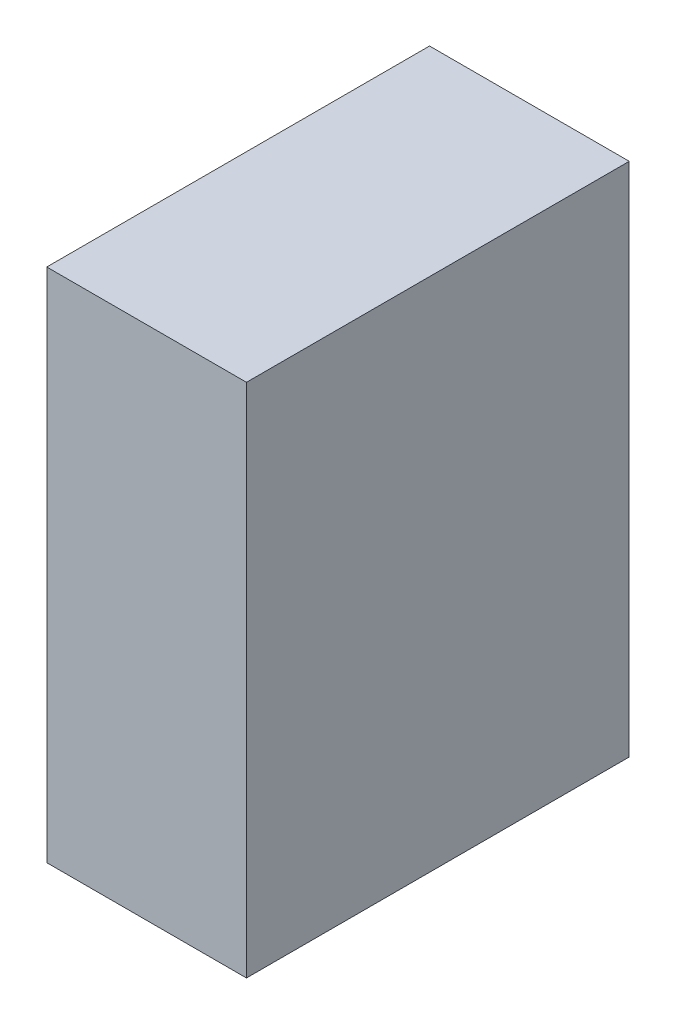
ISO-10303-21;
HEADER;
FILE_DESCRIPTION(('STEP AP214'),'2;1');
FILE_NAME('part.step','',(''),(''),'','','');
FILE_SCHEMA(('AUTOMOTIVE_DESIGN { 1 0 10303 214 1 1 1 1 }'));
ENDSEC;
DATA;
#1=APPLICATION_CONTEXT('core data for automotive mechanical design processes');
#2=APPLICATION_PROTOCOL_DEFINITION('international standard','automotive_design',2000,#1);
#3=PRODUCT_CONTEXT('',#1,'mechanical');
#4=PRODUCT('Part','Part','',(#3));
#5=PRODUCT_RELATED_PRODUCT_CATEGORY('part','',(#4));
#6=PRODUCT_DEFINITION_FORMATION('','',#4);
#7=PRODUCT_DEFINITION_CONTEXT('part definition',#1,'design');
#8=PRODUCT_DEFINITION('design','',#6,#7);
#9=PRODUCT_DEFINITION_SHAPE('','',#8);
#10=(LENGTH_UNIT() NAMED_UNIT(*) SI_UNIT(.MILLI.,.METRE.));
#11=(NAMED_UNIT(*) PLANE_ANGLE_UNIT() SI_UNIT($,.RADIAN.));
#12=(NAMED_UNIT(*) SI_UNIT($,.STERADIAN.) SOLID_ANGLE_UNIT());
#13=UNCERTAINTY_MEASURE_WITH_UNIT(LENGTH_MEASURE(1.E-05),#10,'distance_accuracy_value','');
#14=(GEOMETRIC_REPRESENTATION_CONTEXT(3) GLOBAL_UNCERTAINTY_ASSIGNED_CONTEXT((#13)) GLOBAL_UNIT_ASSIGNED_CONTEXT((#10,
#11,#12)) REPRESENTATION_CONTEXT('',''));
#15=CARTESIAN_POINT('',(0.,0.,0.));
#16=DIRECTION('',(0.,0.,1.));
#17=DIRECTION('',(1.,0.,0.));
#18=AXIS2_PLACEMENT_3D('',#15,#16,#17);
#19=CARTESIAN_POINT('',(76.2,72.9306930693069,41.0235148514852));
#20=DIRECTION('',(0.,0.,-1.));
#21=DIRECTION('',(0.,1.,0.));
#22=AXIS2_PLACEMENT_3D('',#19,#20,#21);
#23=PLANE('',#22);
#24=DIRECTION('',(0.,-1.,0.));
#25=VECTOR('',#24,1.);
#26=CARTESIAN_POINT('',(0.,72.9306930693069,41.0235148514852));
#27=LINE('',#26,#25);
#28=CARTESIAN_POINT('',(0.,72.9306930693069,41.0235148514852));
#29=VERTEX_POINT('',#28);
#30=CARTESIAN_POINT('',(0.,-123.919306930693,41.0235148514851));
#31=VERTEX_POINT('',#30);
#32=EDGE_CURVE('E119',#29,#31,#27,.T.);
#33=ORIENTED_EDGE('',*,*,#32,.T.);
#34=DIRECTION('',(-1.,0.,0.));
#35=VECTOR('',#34,1.);
#36=CARTESIAN_POINT('',(76.2,-123.919306930693,41.0235148514851));
#37=LINE('',#36,#35);
#38=CARTESIAN_POINT('',(76.2,-123.919306930693,41.0235148514851));
#39=VERTEX_POINT('',#38);
#40=EDGE_CURVE('E11',#39,#31,#37,.T.);
#41=ORIENTED_EDGE('',*,*,#40,.F.);
#42=DIRECTION('',(0.,-1.,0.));
#43=VECTOR('',#42,1.);
#44=CARTESIAN_POINT('',(76.2,72.9306930693069,41.0235148514852));
#45=LINE('',#44,#43);
#46=CARTESIAN_POINT('',(76.2,72.9306930693069,41.0235148514852));
#47=VERTEX_POINT('',#46);
#48=EDGE_CURVE('E101',#47,#39,#45,.T.);
#49=ORIENTED_EDGE('',*,*,#48,.F.);
#50=DIRECTION('',(-1.,0.,0.));
#51=VECTOR('',#50,1.);
#52=CARTESIAN_POINT('',(76.2,72.9306930693069,41.0235148514852));
#53=LINE('',#52,#51);
#54=EDGE_CURVE('E115',#47,#29,#53,.T.);
#55=ORIENTED_EDGE('',*,*,#54,.T.);
#56=EDGE_LOOP('',(#33,#41,#49,#55));
#57=FACE_BOUND('',#56,.T.);
#58=ADVANCED_FACE('F47',(#57),#23,.F.);
#59=CARTESIAN_POINT('',(76.2,-123.919306930693,41.0235148514851));
#60=DIRECTION('',(0.,1.,0.));
#61=DIRECTION('',(0.,0.,1.));
#62=AXIS2_PLACEMENT_3D('',#59,#60,#61);
#63=PLANE('',#62);
#64=CARTESIAN_POINT('',(30.4600000000002,-123.919306930693,-30.4464851485151));
#65=DIRECTION('',(0.,-1.,0.));
#66=DIRECTION('',(0.,0.,-1.));
#67=AXIS2_PLACEMENT_3D('',#64,#65,#66);
#68=CIRCLE('',#67,3.96875000000008);
#69=CARTESIAN_POINT('',(30.4600000000002,-123.919306930693,-34.4152351485152));
#70=VERTEX_POINT('',#69);
#71=EDGE_CURVE('E182',#70,#70,#68,.T.);
#72=ORIENTED_EDGE('',*,*,#71,.F.);
#73=EDGE_LOOP('',(#72));
#74=FACE_BOUND('',#73,.T.);
#75=CARTESIAN_POINT('',(24.8406265766137,-123.919306930693,29.145383001778));
#76=DIRECTION('',(0.,-1.,0.));
#77=DIRECTION('',(0.,0.,-1.));
#78=AXIS2_PLACEMENT_3D('',#75,#76,#77);
#79=CIRCLE('',#78,3.96875000000008);
#80=CARTESIAN_POINT('',(24.8406265766137,-123.919306930693,25.176633001778));
#81=VERTEX_POINT('',#80);
#82=EDGE_CURVE('E172',#81,#81,#79,.T.);
#83=ORIENTED_EDGE('',*,*,#82,.F.);
#84=EDGE_LOOP('',(#83));
#85=FACE_BOUND('',#84,.T.);
#86=CARTESIAN_POINT('',(15.9600000000002,-123.919306930693,29.5535148514849));
#87=DIRECTION('',(0.,-1.,0.));
#88=DIRECTION('',(0.,0.,-1.));
#89=AXIS2_PLACEMENT_3D('',#86,#87,#88);
#90=CIRCLE('',#89,3.96875000000008);
#91=CARTESIAN_POINT('',(15.9600000000002,-123.919306930693,25.5847648514849));
#92=VERTEX_POINT('',#91);
#93=EDGE_CURVE('E167',#92,#92,#90,.T.);
#94=ORIENTED_EDGE('',*,*,#93,.F.);
#95=EDGE_LOOP('',(#94));
#96=FACE_BOUND('',#95,.T.);
#97=DIRECTION('',(0.,0.,-1.));
#98=VECTOR('',#97,1.);
#99=CARTESIAN_POINT('',(0.,-123.919306930693,41.0235148514851));
#100=LINE('',#99,#98);
#101=CARTESIAN_POINT('',(0.,-123.919306930693,-105.026485148515));
#102=VERTEX_POINT('',#101);
#103=EDGE_CURVE('E106',#31,#102,#100,.T.);
#104=ORIENTED_EDGE('',*,*,#103,.T.);
#105=DIRECTION('',(-1.,0.,0.));
#106=VECTOR('',#105,1.);
#107=CARTESIAN_POINT('',(76.2,-123.919306930693,-105.026485148515));
#108=LINE('',#107,#106);
#109=CARTESIAN_POINT('',(76.2,-123.919306930693,-105.026485148515));
#110=VERTEX_POINT('',#109);
#111=EDGE_CURVE('E57',#110,#102,#108,.T.);
#112=ORIENTED_EDGE('',*,*,#111,.F.);
#113=DIRECTION('',(0.,0.,-1.));
#114=VECTOR('',#113,1.);
#115=CARTESIAN_POINT('',(76.2,-123.919306930693,41.0235148514851));
#116=LINE('',#115,#114);
#117=EDGE_CURVE('E96',#39,#110,#116,.T.);
#118=ORIENTED_EDGE('',*,*,#117,.F.);
#119=ORIENTED_EDGE('',*,*,#40,.T.);
#120=EDGE_LOOP('',(#104,#112,#118,#119));
#121=FACE_BOUND('',#120,.T.);
#122=ADVANCED_FACE('F105',(#74,#85,#96,#121),#63,.F.);
#123=CARTESIAN_POINT('',(76.2,72.9306930693069,-105.026485148515));
#124=DIRECTION('',(0.,0.,1.));
#125=DIRECTION('',(0.,-1.,0.));
#126=AXIS2_PLACEMENT_3D('',#123,#124,#125);
#127=PLANE('',#126);
#128=CARTESIAN_POINT('',(20.9600000000001,-56.151306930693,-105.026485148515));
#129=DIRECTION('',(0.,0.,-1.));
#130=DIRECTION('',(0.,1.,0.));
#131=AXIS2_PLACEMENT_3D('',#128,#129,#130);
#132=CIRCLE('',#131,4.);
#133=CARTESIAN_POINT('',(20.9600000000001,-52.151306930693,-105.026485148515));
#134=VERTEX_POINT('',#133);
#135=EDGE_CURVE('E199',#134,#134,#132,.T.);
#136=ORIENTED_EDGE('',*,*,#135,.F.);
#137=EDGE_LOOP('',(#136));
#138=FACE_BOUND('',#137,.T.);
#139=CARTESIAN_POINT('',(20.9600000000001,13.8486930693069,-105.026485148515));
#140=DIRECTION('',(0.,0.,-1.));
#141=DIRECTION('',(0.,1.,0.));
#142=AXIS2_PLACEMENT_3D('',#139,#140,#141);
#143=CIRCLE('',#142,4.);
#144=CARTESIAN_POINT('',(20.9600000000001,17.8486930693069,-105.026485148515));
#145=VERTEX_POINT('',#144);
#146=EDGE_CURVE('E195',#145,#145,#143,.T.);
#147=ORIENTED_EDGE('',*,*,#146,.F.);
#148=EDGE_LOOP('',(#147));
#149=FACE_BOUND('',#148,.T.);
#150=DIRECTION('',(0.,1.,0.));
#151=VECTOR('',#150,1.);
#152=CARTESIAN_POINT('',(0.,72.9306930693069,-105.026485148515));
#153=LINE('',#152,#151);
#154=CARTESIAN_POINT('',(0.,72.9306930693069,-105.026485148515));
#155=VERTEX_POINT('',#154);
#156=EDGE_CURVE('E83',#102,#155,#153,.T.);
#157=ORIENTED_EDGE('',*,*,#156,.T.);
#158=DIRECTION('',(-1.,0.,0.));
#159=VECTOR('',#158,1.);
#160=CARTESIAN_POINT('',(76.2,72.9306930693069,-105.026485148515));
#161=LINE('',#160,#159);
#162=CARTESIAN_POINT('',(76.2,72.9306930693069,-105.026485148515));
#163=VERTEX_POINT('',#162);
#164=EDGE_CURVE('E108',#163,#155,#161,.T.);
#165=ORIENTED_EDGE('',*,*,#164,.F.);
#166=DIRECTION('',(0.,1.,0.));
#167=VECTOR('',#166,1.);
#168=CARTESIAN_POINT('',(76.2,72.9306930693069,-105.026485148515));
#169=LINE('',#168,#167);
#170=EDGE_CURVE('E99',#110,#163,#169,.T.);
#171=ORIENTED_EDGE('',*,*,#170,.F.);
#172=ORIENTED_EDGE('',*,*,#111,.T.);
#173=EDGE_LOOP('',(#157,#165,#171,#172));
#174=FACE_BOUND('',#173,.T.);
#175=ADVANCED_FACE('F110',(#138,#149,#174),#127,.F.);
#176=CARTESIAN_POINT('',(76.2,72.9306930693069,41.0235148514852));
#177=DIRECTION('',(0.,-1.,0.));
#178=DIRECTION('',(0.,0.,-1.));
#179=AXIS2_PLACEMENT_3D('',#176,#177,#178);
#180=PLANE('',#179);
#181=DIRECTION('',(0.,0.,1.));
#182=VECTOR('',#181,1.);
#183=CARTESIAN_POINT('',(0.,72.9306930693069,41.0235148514852));
#184=LINE('',#183,#182);
#185=EDGE_CURVE('E89',#155,#29,#184,.T.);
#186=ORIENTED_EDGE('',*,*,#185,.T.);
#187=ORIENTED_EDGE('',*,*,#54,.F.);
#188=DIRECTION('',(0.,0.,1.));
#189=VECTOR('',#188,1.);
#190=CARTESIAN_POINT('',(76.2,72.9306930693069,41.0235148514852));
#191=LINE('',#190,#189);
#192=EDGE_CURVE('E66',#163,#47,#191,.T.);
#193=ORIENTED_EDGE('',*,*,#192,.F.);
#194=ORIENTED_EDGE('',*,*,#164,.T.);
#195=EDGE_LOOP('',(#186,#187,#193,#194));
#196=FACE_BOUND('',#195,.T.);
#197=ADVANCED_FACE('F219',(#196),#180,.F.);
#198=CARTESIAN_POINT('',(76.2,0.,0.));
#199=DIRECTION('',(1.,0.,0.));
#200=DIRECTION('',(0.,0.,-1.));
#201=AXIS2_PLACEMENT_3D('',#198,#199,#200);
#202=PLANE('',#201);
#203=ORIENTED_EDGE('',*,*,#48,.T.);
#204=ORIENTED_EDGE('',*,*,#117,.T.);
#205=ORIENTED_EDGE('',*,*,#170,.T.);
#206=ORIENTED_EDGE('',*,*,#192,.T.);
#207=EDGE_LOOP('',(#203,#204,#205,#206));
#208=FACE_BOUND('',#207,.T.);
#209=ADVANCED_FACE('F97',(#208),#202,.T.);
#210=CARTESIAN_POINT('',(0.,0.,0.));
#211=DIRECTION('',(1.,0.,0.));
#212=DIRECTION('',(0.,0.,-1.));
#213=AXIS2_PLACEMENT_3D('',#210,#211,#212);
#214=PLANE('',#213);
#215=ORIENTED_EDGE('',*,*,#32,.F.);
#216=ORIENTED_EDGE('',*,*,#185,.F.);
#217=ORIENTED_EDGE('',*,*,#156,.F.);
#218=ORIENTED_EDGE('',*,*,#103,.F.);
#219=EDGE_LOOP('',(#215,#216,#217,#218));
#220=FACE_BOUND('',#219,.T.);
#221=ADVANCED_FACE('F247',(#220),#214,.F.);
#222=CARTESIAN_POINT('',(15.9600000000002,-73.3513105306931,29.5535148514849));
#223=DIRECTION('',(0.,-1.,0.));
#224=DIRECTION('',(0.,0.,-1.));
#225=AXIS2_PLACEMENT_3D('',#222,#223,#224);
#226=PLANE('',#225);
#227=CARTESIAN_POINT('',(15.9600000000002,-73.3513105306931,29.5535148514849));
#228=DIRECTION('',(0.,-1.,0.));
#229=DIRECTION('',(0.,0.,-1.));
#230=AXIS2_PLACEMENT_3D('',#227,#228,#229);
#231=CIRCLE('',#230,3.96875000000008);
#232=CARTESIAN_POINT('',(15.9600000000002,-73.3513105306931,25.5847648514849));
#233=VERTEX_POINT('',#232);
#234=EDGE_CURVE('E163',#233,#233,#231,.T.);
#235=ORIENTED_EDGE('',*,*,#234,.T.);
#236=EDGE_LOOP('',(#235));
#237=FACE_BOUND('',#236,.T.);
#238=CARTESIAN_POINT('',(15.9600000000002,-73.3513105306931,29.5535148514849));
#239=DIRECTION('',(0.,-1.,0.));
#240=DIRECTION('',(0.,0.,-1.));
#241=AXIS2_PLACEMENT_3D('',#238,#239,#240);
#242=CIRCLE('',#241,3.17499999999993);
#243=CARTESIAN_POINT('',(15.9600000000002,-73.3513105306931,26.378514851485));
#244=VERTEX_POINT('',#243);
#245=EDGE_CURVE('E134',#244,#244,#242,.F.);
#246=ORIENTED_EDGE('',*,*,#245,.T.);
#247=EDGE_LOOP('',(#246));
#248=FACE_BOUND('',#247,.T.);
#249=ADVANCED_FACE('F249',(#237,#248),#226,.T.);
#250=CARTESIAN_POINT('',(15.9600000000002,-73.3513105306931,29.5535148514849));
#251=DIRECTION('',(0.,-1.,0.));
#252=DIRECTION('',(0.,0.,-1.));
#253=AXIS2_PLACEMENT_3D('',#250,#251,#252);
#254=CYLINDRICAL_SURFACE('',#253,3.96875000000008);
#255=ORIENTED_EDGE('',*,*,#234,.F.);
#256=EDGE_LOOP('',(#255));
#257=FACE_BOUND('',#256,.T.);
#258=ORIENTED_EDGE('',*,*,#93,.T.);
#259=EDGE_LOOP('',(#258));
#260=FACE_BOUND('',#259,.T.);
#261=ADVANCED_FACE('F256',(#257,#260),#254,.F.);
#262=CARTESIAN_POINT('',(24.8406265766137,-73.3513105306931,29.145383001778));
#263=DIRECTION('',(0.,-1.,0.));
#264=DIRECTION('',(0.,0.,-1.));
#265=AXIS2_PLACEMENT_3D('',#262,#263,#264);
#266=PLANE('',#265);
#267=CARTESIAN_POINT('',(24.8406265766137,-73.3513105306931,29.145383001778));
#268=DIRECTION('',(0.,-1.,0.));
#269=DIRECTION('',(0.,0.,-1.));
#270=AXIS2_PLACEMENT_3D('',#267,#268,#269);
#271=CIRCLE('',#270,3.96875000000008);
#272=CARTESIAN_POINT('',(24.8406265766137,-73.3513105306931,25.176633001778));
#273=VERTEX_POINT('',#272);
#274=EDGE_CURVE('E138',#273,#273,#271,.T.);
#275=ORIENTED_EDGE('',*,*,#274,.T.);
#276=EDGE_LOOP('',(#275));
#277=FACE_BOUND('',#276,.T.);
#278=CARTESIAN_POINT('',(24.8421301301385,-73.3513105306931,29.1795304249527));
#279=DIRECTION('',(0.,-1.,0.));
#280=DIRECTION('',(0.,0.,-1.));
#281=AXIS2_PLACEMENT_3D('',#278,#279,#280);
#282=CIRCLE('',#281,3.17499999999993);
#283=CARTESIAN_POINT('',(24.8421301301385,-73.3513105306931,26.0045304249528));
#284=VERTEX_POINT('',#283);
#285=EDGE_CURVE('E137',#284,#284,#282,.F.);
#286=ORIENTED_EDGE('',*,*,#285,.T.);
#287=EDGE_LOOP('',(#286));
#288=FACE_BOUND('',#287,.T.);
#289=ADVANCED_FACE('F327',(#277,#288),#266,.T.);
#290=CARTESIAN_POINT('',(24.8406265766137,-73.3513105306931,29.145383001778));
#291=DIRECTION('',(0.,-1.,0.));
#292=DIRECTION('',(0.,0.,-1.));
#293=AXIS2_PLACEMENT_3D('',#290,#291,#292);
#294=CYLINDRICAL_SURFACE('',#293,3.96875000000008);
#295=ORIENTED_EDGE('',*,*,#274,.F.);
#296=EDGE_LOOP('',(#295));
#297=FACE_BOUND('',#296,.T.);
#298=ORIENTED_EDGE('',*,*,#82,.T.);
#299=EDGE_LOOP('',(#298));
#300=FACE_BOUND('',#299,.T.);
#301=ADVANCED_FACE('F294',(#297,#300),#294,.F.);
#302=CARTESIAN_POINT('',(15.9600000000002,-49.3513077306931,29.5535148514849));
#303=DIRECTION('',(0.,-1.,0.));
#304=DIRECTION('',(0.,0.,-1.));
#305=AXIS2_PLACEMENT_3D('',#302,#303,#304);
#306=PLANE('',#305);
#307=CARTESIAN_POINT('',(15.9600000000002,-49.3513077306931,29.5535148514849));
#308=DIRECTION('',(0.,-1.,0.));
#309=DIRECTION('',(0.,0.,-1.));
#310=AXIS2_PLACEMENT_3D('',#307,#308,#309);
#311=CIRCLE('',#310,3.17499999999993);
#312=CARTESIAN_POINT('',(15.9600000000002,-49.3513077306931,26.378514851485));
#313=VERTEX_POINT('',#312);
#314=EDGE_CURVE('E123',#313,#313,#311,.T.);
#315=ORIENTED_EDGE('',*,*,#314,.T.);
#316=EDGE_LOOP('',(#315));
#317=FACE_BOUND('',#316,.T.);
#318=ADVANCED_FACE('F290',(#317),#306,.T.);
#319=CARTESIAN_POINT('',(15.9600000000002,-49.3513077306931,29.5535148514849));
#320=DIRECTION('',(0.,-1.,0.));
#321=DIRECTION('',(0.,0.,-1.));
#322=AXIS2_PLACEMENT_3D('',#319,#320,#321);
#323=CYLINDRICAL_SURFACE('',#322,3.17499999999993);
#324=ORIENTED_EDGE('',*,*,#314,.F.);
#325=EDGE_LOOP('',(#324));
#326=FACE_BOUND('',#325,.T.);
#327=ORIENTED_EDGE('',*,*,#245,.F.);
#328=EDGE_LOOP('',(#327));
#329=FACE_BOUND('',#328,.T.);
#330=ADVANCED_FACE('F285',(#326,#329),#323,.F.);
#331=CARTESIAN_POINT('',(24.8421301301385,-49.3513077306931,29.1795304249527));
#332=DIRECTION('',(0.,-1.,0.));
#333=DIRECTION('',(0.,0.,-1.));
#334=AXIS2_PLACEMENT_3D('',#331,#332,#333);
#335=PLANE('',#334);
#336=CARTESIAN_POINT('',(24.8421301301385,-49.3513077306931,29.1795304249527));
#337=DIRECTION('',(0.,-1.,0.));
#338=DIRECTION('',(0.,0.,-1.));
#339=AXIS2_PLACEMENT_3D('',#336,#337,#338);
#340=CIRCLE('',#339,3.17499999999993);
#341=CARTESIAN_POINT('',(24.8421301301385,-49.3513077306931,26.0045304249528));
#342=VERTEX_POINT('',#341);
#343=EDGE_CURVE('E141',#342,#342,#340,.T.);
#344=ORIENTED_EDGE('',*,*,#343,.T.);
#345=EDGE_LOOP('',(#344));
#346=FACE_BOUND('',#345,.T.);
#347=ADVANCED_FACE('F280',(#346),#335,.T.);
#348=CARTESIAN_POINT('',(24.8421301301385,-49.3513077306931,29.1795304249527));
#349=DIRECTION('',(0.,-1.,0.));
#350=DIRECTION('',(0.,0.,-1.));
#351=AXIS2_PLACEMENT_3D('',#348,#349,#350);
#352=CYLINDRICAL_SURFACE('',#351,3.17499999999993);
#353=ORIENTED_EDGE('',*,*,#343,.F.);
#354=EDGE_LOOP('',(#353));
#355=FACE_BOUND('',#354,.T.);
#356=ORIENTED_EDGE('',*,*,#285,.F.);
#357=EDGE_LOOP('',(#356));
#358=FACE_BOUND('',#357,.T.);
#359=ADVANCED_FACE('F284',(#355,#358),#352,.F.);
#360=CARTESIAN_POINT('',(30.4600000000002,-117.651298130693,-30.4464851485151));
#361=DIRECTION('',(0.,-1.,0.));
#362=DIRECTION('',(0.,0.,-1.));
#363=AXIS2_PLACEMENT_3D('',#360,#361,#362);
#364=PLANE('',#363);
#365=CARTESIAN_POINT('',(30.4600000000002,-117.651298130693,-30.4464851485151));
#366=DIRECTION('',(0.,-1.,0.));
#367=DIRECTION('',(0.,0.,-1.));
#368=AXIS2_PLACEMENT_3D('',#365,#366,#367);
#369=CIRCLE('',#368,3.96875000000008);
#370=CARTESIAN_POINT('',(30.4600000000002,-117.651298130693,-34.4152351485152));
#371=VERTEX_POINT('',#370);
#372=EDGE_CURVE('E186',#371,#371,#369,.T.);
#373=ORIENTED_EDGE('',*,*,#372,.T.);
#374=EDGE_LOOP('',(#373));
#375=FACE_BOUND('',#374,.T.);
#376=CARTESIAN_POINT('',(30.4600000000002,-117.651298130693,-30.4464851485151));
#377=DIRECTION('',(0.,-1.,0.));
#378=DIRECTION('',(0.,0.,-1.));
#379=AXIS2_PLACEMENT_3D('',#376,#377,#378);
#380=CIRCLE('',#379,3.17499999999993);
#381=CARTESIAN_POINT('',(30.4600000000002,-117.651298130693,-33.621485148515));
#382=VERTEX_POINT('',#381);
#383=EDGE_CURVE('E50',#382,#382,#380,.F.);
#384=ORIENTED_EDGE('',*,*,#383,.T.);
#385=EDGE_LOOP('',(#384));
#386=FACE_BOUND('',#385,.T.);
#387=ADVANCED_FACE('F312',(#375,#386),#364,.T.);
#388=CARTESIAN_POINT('',(30.4600000000002,-117.651298130693,-30.4464851485151));
#389=DIRECTION('',(0.,-1.,0.));
#390=DIRECTION('',(0.,0.,-1.));
#391=AXIS2_PLACEMENT_3D('',#388,#389,#390);
#392=CYLINDRICAL_SURFACE('',#391,3.96875000000008);
#393=ORIENTED_EDGE('',*,*,#372,.F.);
#394=EDGE_LOOP('',(#393));
#395=FACE_BOUND('',#394,.T.);
#396=ORIENTED_EDGE('',*,*,#71,.T.);
#397=EDGE_LOOP('',(#396));
#398=FACE_BOUND('',#397,.T.);
#399=ADVANCED_FACE('F355',(#395,#398),#392,.F.);
#400=CARTESIAN_POINT('',(30.4600000000002,-85.6513113306931,-30.4464851485151));
#401=DIRECTION('',(0.,-1.,0.));
#402=DIRECTION('',(0.,0.,-1.));
#403=AXIS2_PLACEMENT_3D('',#400,#401,#402);
#404=PLANE('',#403);
#405=CARTESIAN_POINT('',(30.4600000000002,-85.6513113306931,-30.4464851485151));
#406=DIRECTION('',(0.,-1.,0.));
#407=DIRECTION('',(0.,0.,-1.));
#408=AXIS2_PLACEMENT_3D('',#405,#406,#407);
#409=CIRCLE('',#408,3.17499999999993);
#410=CARTESIAN_POINT('',(30.4600000000002,-85.6513113306931,-33.621485148515));
#411=VERTEX_POINT('',#410);
#412=EDGE_CURVE('E168',#411,#411,#409,.T.);
#413=ORIENTED_EDGE('',*,*,#412,.T.);
#414=EDGE_LOOP('',(#413));
#415=FACE_BOUND('',#414,.T.);
#416=ADVANCED_FACE('F234',(#415),#404,.T.);
#417=CARTESIAN_POINT('',(30.4600000000002,-85.6513113306931,-30.4464851485151));
#418=DIRECTION('',(0.,-1.,0.));
#419=DIRECTION('',(0.,0.,-1.));
#420=AXIS2_PLACEMENT_3D('',#417,#418,#419);
#421=CYLINDRICAL_SURFACE('',#420,3.17499999999993);
#422=ORIENTED_EDGE('',*,*,#412,.F.);
#423=EDGE_LOOP('',(#422));
#424=FACE_BOUND('',#423,.T.);
#425=ORIENTED_EDGE('',*,*,#383,.F.);
#426=EDGE_LOOP('',(#425));
#427=FACE_BOUND('',#426,.T.);
#428=ADVANCED_FACE('F225',(#424,#427),#421,.F.);
#429=CARTESIAN_POINT('',(20.9600000000001,13.8486930693069,-91.9464757485148));
#430=DIRECTION('',(0.,0.,-1.));
#431=DIRECTION('',(0.,1.,0.));
#432=AXIS2_PLACEMENT_3D('',#429,#430,#431);
#433=CYLINDRICAL_SURFACE('',#432,4.);
#434=CARTESIAN_POINT('',(20.9600000000001,13.8486930693069,-91.9464757485148));
#435=DIRECTION('',(0.,0.,-1.));
#436=DIRECTION('',(0.,1.,0.));
#437=AXIS2_PLACEMENT_3D('',#434,#435,#436);
#438=CIRCLE('',#437,4.);
#439=CARTESIAN_POINT('',(20.9600000000001,17.8486930693069,-91.9464757485148));
#440=VERTEX_POINT('',#439);
#441=EDGE_CURVE('E191',#440,#440,#438,.T.);
#442=CARTESIAN_POINT('',(20.9600000000001,17.8486930693069,-91.9464757485148));
#443=CARTESIAN_POINT('',(20.9600000000001,17.8486930693069,-92.0827258464315));
#444=CARTESIAN_POINT('',(20.9600000000001,17.8486930693069,-92.2189759443482));
#445=CARTESIAN_POINT('',(20.9600000000001,17.8486930693069,-92.4914761401815));
#446=CARTESIAN_POINT('',(20.9600000000001,17.8486930693069,-92.6277262380982));
#447=CARTESIAN_POINT('',(20.9600000000001,17.8486930693069,-92.9002264339315));
#448=CARTESIAN_POINT('',(20.9600000000001,17.8486930693069,-93.0364765318482));
#449=CARTESIAN_POINT('',(20.9600000000001,17.8486930693069,-93.3089767276815));
#450=CARTESIAN_POINT('',(20.9600000000001,17.8486930693069,-93.4452268255982));
#451=CARTESIAN_POINT('',(20.9600000000001,17.8486930693069,-93.7177270214315));
#452=CARTESIAN_POINT('',(20.9600000000001,17.8486930693069,-93.8539771193482));
#453=CARTESIAN_POINT('',(20.9600000000001,17.8486930693069,-94.1264773151815));
#454=CARTESIAN_POINT('',(20.9600000000001,17.8486930693069,-94.2627274130982));
#455=CARTESIAN_POINT('',(20.9600000000001,17.8486930693069,-94.5352276089315));
#456=CARTESIAN_POINT('',(20.9600000000001,17.8486930693069,-94.6714777068482));
#457=CARTESIAN_POINT('',(20.9600000000001,17.8486930693069,-94.9439779026815));
#458=CARTESIAN_POINT('',(20.9600000000001,17.8486930693069,-95.0802280005982));
#459=CARTESIAN_POINT('',(20.9600000000001,17.8486930693069,-95.3527281964315));
#460=CARTESIAN_POINT('',(20.9600000000001,17.8486930693069,-95.4889782943482));
#461=CARTESIAN_POINT('',(20.9600000000001,17.8486930693069,-95.7614784901815));
#462=CARTESIAN_POINT('',(20.9600000000001,17.8486930693069,-95.8977285880982));
#463=CARTESIAN_POINT('',(20.9600000000001,17.8486930693069,-96.1702287839315));
#464=CARTESIAN_POINT('',(20.9600000000001,17.8486930693069,-96.3064788818482));
#465=CARTESIAN_POINT('',(20.9600000000001,17.8486930693069,-96.5789790776815));
#466=CARTESIAN_POINT('',(20.9600000000001,17.8486930693069,-96.7152291755982));
#467=CARTESIAN_POINT('',(20.9600000000001,17.8486930693069,-96.9877293714315));
#468=CARTESIAN_POINT('',(20.9600000000001,17.8486930693069,-97.1239794693482));
#469=CARTESIAN_POINT('',(20.9600000000001,17.8486930693069,-97.3964796651815));
#470=CARTESIAN_POINT('',(20.9600000000001,17.8486930693069,-97.5327297630982));
#471=CARTESIAN_POINT('',(20.9600000000001,17.8486930693069,-97.8052299589315));
#472=CARTESIAN_POINT('',(20.9600000000001,17.8486930693069,-97.9414800568482));
#473=CARTESIAN_POINT('',(20.9600000000001,17.8486930693069,-98.2139802526815));
#474=CARTESIAN_POINT('',(20.9600000000001,17.8486930693069,-98.3502303505982));
#475=CARTESIAN_POINT('',(20.9600000000001,17.8486930693069,-98.6227305464315));
#476=CARTESIAN_POINT('',(20.9600000000001,17.8486930693069,-98.7589806443482));
#477=CARTESIAN_POINT('',(20.9600000000001,17.8486930693069,-99.0314808401815));
#478=CARTESIAN_POINT('',(20.9600000000001,17.8486930693069,-99.1677309380982));
#479=CARTESIAN_POINT('',(20.9600000000001,17.8486930693069,-99.4402311339315));
#480=CARTESIAN_POINT('',(20.9600000000001,17.8486930693069,-99.5764812318482));
#481=CARTESIAN_POINT('',(20.9600000000001,17.8486930693069,-99.8489814276815));
#482=CARTESIAN_POINT('',(20.9600000000001,17.8486930693069,-99.9852315255982));
#483=CARTESIAN_POINT('',(20.9600000000001,17.8486930693069,-100.257731721431));
#484=CARTESIAN_POINT('',(20.9600000000001,17.8486930693069,-100.393981819348));
#485=CARTESIAN_POINT('',(20.9600000000001,17.8486930693069,-100.666482015181));
#486=CARTESIAN_POINT('',(20.9600000000001,17.8486930693069,-100.802732113098));
#487=CARTESIAN_POINT('',(20.9600000000001,17.8486930693069,-101.075232308931));
#488=CARTESIAN_POINT('',(20.9600000000001,17.8486930693069,-101.211482406848));
#489=CARTESIAN_POINT('',(20.9600000000001,17.8486930693069,-101.483982602681));
#490=CARTESIAN_POINT('',(20.9600000000001,17.8486930693069,-101.620232700598));
#491=CARTESIAN_POINT('',(20.9600000000001,17.8486930693069,-101.892732896431));
#492=CARTESIAN_POINT('',(20.9600000000001,17.8486930693069,-102.028982994348));
#493=CARTESIAN_POINT('',(20.9600000000001,17.8486930693069,-102.301483190182));
#494=CARTESIAN_POINT('',(20.9600000000001,17.8486930693069,-102.437733288098));
#495=CARTESIAN_POINT('',(20.9600000000001,17.8486930693069,-102.710233483931));
#496=CARTESIAN_POINT('',(20.9600000000001,17.8486930693069,-102.846483581848));
#497=CARTESIAN_POINT('',(20.9600000000001,17.8486930693069,-103.118983777681));
#498=CARTESIAN_POINT('',(20.9600000000001,17.8486930693069,-103.255233875598));
#499=CARTESIAN_POINT('',(20.9600000000001,17.8486930693069,-103.527734071431));
#500=CARTESIAN_POINT('',(20.9600000000001,17.8486930693069,-103.663984169348));
#501=CARTESIAN_POINT('',(20.9600000000001,17.8486930693069,-103.936484365181));
#502=CARTESIAN_POINT('',(20.9600000000001,17.8486930693069,-104.072734463098));
#503=CARTESIAN_POINT('',(20.9600000000001,17.8486930693069,-104.345234658931));
#504=CARTESIAN_POINT('',(20.9600000000001,17.8486930693069,-104.481484756848));
#505=CARTESIAN_POINT('',(20.9600000000001,17.8486930693069,-104.753984952681));
#506=CARTESIAN_POINT('',(20.9600000000001,17.8486930693069,-104.890235050598));
#507=CARTESIAN_POINT('',(20.9600000000001,17.8486930693069,-105.026485148515));
#508=B_SPLINE_CURVE_WITH_KNOTS('',3,(#442,#443,#444,#445,#446,#447,#448,#449,#450,#451,#452,
#453,#454,#455,#456,#457,#458,#459,#460,#461,#462,#463,#464,#465,#466,#467,#468,#469,#470,#471,
#472,#473,#474,#475,#476,#477,#478,#479,#480,#481,#482,#483,#484,#485,#486,#487,#488,#489,#490,
#491,#492,#493,#494,#495,#496,#497,#498,#499,#500,#501,#502,#503,#504,#505,#506,#507),
.UNSPECIFIED.,.F.,.F.,(4,2,2,2,2,2,2,2,2,2,2,2,2,2,2,2,2,2,2,2,2,2,2,2,2,2,2,2,2,2,2,2,4),(0.,
0.408750293749996,0.817500587499992,1.22625088124999,1.635001175,2.04375146874999,
2.45250176249999,2.86125205624999,3.27000235,3.67875264374999,4.08750293749999,4.49625323125,
4.90500352499999,5.31375381874999,5.7225041125,6.13125440624999,6.54000469999999,
6.94875499374999,7.3575052875,7.76625558124999,8.17500587499999,8.58375616874998,
8.99250646249999,9.40125675624999,9.81000704999999,10.21875734375,10.6275076375,11.03625793125,
11.445008225,11.85375851875,12.2625088125,12.67125910625,13.0800094),.UNSPECIFIED.);
#509=EDGE_CURVE('BSEAM223',#440,#145,#508,.T.);
#510=ORIENTED_EDGE('',*,*,#441,.F.);
#511=ORIENTED_EDGE('',*,*,#146,.T.);
#512=ORIENTED_EDGE('',*,*,#509,.T.);
#513=ORIENTED_EDGE('',*,*,#509,.F.);
#514=EDGE_LOOP('',(#510,#512,#511,#513));
#515=FACE_BOUND('',#514,.T.);
#516=ADVANCED_FACE('F223',(#515),#433,.F.);
#517=CARTESIAN_POINT('',(20.9600000000001,13.8486930693069,-91.9464757485148));
#518=DIRECTION('',(0.,0.,-1.));
#519=DIRECTION('',(0.,1.,0.));
#520=AXIS2_PLACEMENT_3D('',#517,#518,#519);
#521=PLANE('',#520);
#522=ORIENTED_EDGE('',*,*,#441,.T.);
#523=EDGE_LOOP('',(#522));
#524=FACE_BOUND('',#523,.T.);
#525=ADVANCED_FACE('F213',(#524),#521,.T.);
#526=CARTESIAN_POINT('',(20.9600000000001,-56.151306930693,-91.9464757485148));
#527=DIRECTION('',(0.,0.,-1.));
#528=DIRECTION('',(0.,1.,0.));
#529=AXIS2_PLACEMENT_3D('',#526,#527,#528);
#530=CYLINDRICAL_SURFACE('',#529,4.);
#531=CARTESIAN_POINT('',(20.9600000000001,-56.151306930693,-91.9464757485148));
#532=DIRECTION('',(0.,0.,-1.));
#533=DIRECTION('',(0.,1.,0.));
#534=AXIS2_PLACEMENT_3D('',#531,#532,#533);
#535=CIRCLE('',#534,4.);
#536=CARTESIAN_POINT('',(20.9600000000001,-52.151306930693,-91.9464757485148));
#537=VERTEX_POINT('',#536);
#538=EDGE_CURVE('E187',#537,#537,#535,.T.);
#539=CARTESIAN_POINT('',(20.9600000000001,-52.151306930693,-91.9464757485148));
#540=CARTESIAN_POINT('',(20.9600000000001,-52.151306930693,-92.0827258464315));
#541=CARTESIAN_POINT('',(20.9600000000001,-52.151306930693,-92.2189759443482));
#542=CARTESIAN_POINT('',(20.9600000000001,-52.151306930693,-92.4914761401815));
#543=CARTESIAN_POINT('',(20.9600000000001,-52.151306930693,-92.6277262380982));
#544=CARTESIAN_POINT('',(20.9600000000001,-52.151306930693,-92.9002264339315));
#545=CARTESIAN_POINT('',(20.9600000000001,-52.151306930693,-93.0364765318482));
#546=CARTESIAN_POINT('',(20.9600000000001,-52.151306930693,-93.3089767276815));
#547=CARTESIAN_POINT('',(20.9600000000001,-52.151306930693,-93.4452268255982));
#548=CARTESIAN_POINT('',(20.9600000000001,-52.151306930693,-93.7177270214315));
#549=CARTESIAN_POINT('',(20.9600000000001,-52.151306930693,-93.8539771193482));
#550=CARTESIAN_POINT('',(20.9600000000001,-52.151306930693,-94.1264773151815));
#551=CARTESIAN_POINT('',(20.9600000000001,-52.151306930693,-94.2627274130982));
#552=CARTESIAN_POINT('',(20.9600000000001,-52.151306930693,-94.5352276089315));
#553=CARTESIAN_POINT('',(20.9600000000001,-52.151306930693,-94.6714777068482));
#554=CARTESIAN_POINT('',(20.9600000000001,-52.151306930693,-94.9439779026815));
#555=CARTESIAN_POINT('',(20.9600000000001,-52.151306930693,-95.0802280005982));
#556=CARTESIAN_POINT('',(20.9600000000001,-52.151306930693,-95.3527281964315));
#557=CARTESIAN_POINT('',(20.9600000000001,-52.151306930693,-95.4889782943482));
#558=CARTESIAN_POINT('',(20.9600000000001,-52.151306930693,-95.7614784901815));
#559=CARTESIAN_POINT('',(20.9600000000001,-52.151306930693,-95.8977285880982));
#560=CARTESIAN_POINT('',(20.9600000000001,-52.151306930693,-96.1702287839315));
#561=CARTESIAN_POINT('',(20.9600000000001,-52.151306930693,-96.3064788818482));
#562=CARTESIAN_POINT('',(20.9600000000001,-52.151306930693,-96.5789790776815));
#563=CARTESIAN_POINT('',(20.9600000000001,-52.151306930693,-96.7152291755982));
#564=CARTESIAN_POINT('',(20.9600000000001,-52.151306930693,-96.9877293714315));
#565=CARTESIAN_POINT('',(20.9600000000001,-52.151306930693,-97.1239794693482));
#566=CARTESIAN_POINT('',(20.9600000000001,-52.151306930693,-97.3964796651815));
#567=CARTESIAN_POINT('',(20.9600000000001,-52.151306930693,-97.5327297630982));
#568=CARTESIAN_POINT('',(20.9600000000001,-52.151306930693,-97.8052299589315));
#569=CARTESIAN_POINT('',(20.9600000000001,-52.151306930693,-97.9414800568482));
#570=CARTESIAN_POINT('',(20.9600000000001,-52.151306930693,-98.2139802526815));
#571=CARTESIAN_POINT('',(20.9600000000001,-52.151306930693,-98.3502303505982));
#572=CARTESIAN_POINT('',(20.9600000000001,-52.151306930693,-98.6227305464315));
#573=CARTESIAN_POINT('',(20.9600000000001,-52.151306930693,-98.7589806443482));
#574=CARTESIAN_POINT('',(20.9600000000001,-52.151306930693,-99.0314808401815));
#575=CARTESIAN_POINT('',(20.9600000000001,-52.151306930693,-99.1677309380982));
#576=CARTESIAN_POINT('',(20.9600000000001,-52.151306930693,-99.4402311339315));
#577=CARTESIAN_POINT('',(20.9600000000001,-52.151306930693,-99.5764812318482));
#578=CARTESIAN_POINT('',(20.9600000000001,-52.151306930693,-99.8489814276815));
#579=CARTESIAN_POINT('',(20.9600000000001,-52.151306930693,-99.9852315255982));
#580=CARTESIAN_POINT('',(20.9600000000001,-52.151306930693,-100.257731721431));
#581=CARTESIAN_POINT('',(20.9600000000001,-52.151306930693,-100.393981819348));
#582=CARTESIAN_POINT('',(20.9600000000001,-52.151306930693,-100.666482015182));
#583=CARTESIAN_POINT('',(20.9600000000001,-52.151306930693,-100.802732113098));
#584=CARTESIAN_POINT('',(20.9600000000001,-52.151306930693,-101.075232308932));
#585=CARTESIAN_POINT('',(20.9600000000001,-52.151306930693,-101.211482406848));
#586=CARTESIAN_POINT('',(20.9600000000001,-52.151306930693,-101.483982602682));
#587=CARTESIAN_POINT('',(20.9600000000001,-52.151306930693,-101.620232700598));
#588=CARTESIAN_POINT('',(20.9600000000001,-52.151306930693,-101.892732896431));
#589=CARTESIAN_POINT('',(20.9600000000001,-52.151306930693,-102.028982994348));
#590=CARTESIAN_POINT('',(20.9600000000001,-52.151306930693,-102.301483190182));
#591=CARTESIAN_POINT('',(20.9600000000001,-52.151306930693,-102.437733288098));
#592=CARTESIAN_POINT('',(20.9600000000001,-52.151306930693,-102.710233483932));
#593=CARTESIAN_POINT('',(20.9600000000001,-52.151306930693,-102.846483581848));
#594=CARTESIAN_POINT('',(20.9600000000001,-52.151306930693,-103.118983777682));
#595=CARTESIAN_POINT('',(20.9600000000001,-52.151306930693,-103.255233875598));
#596=CARTESIAN_POINT('',(20.9600000000001,-52.151306930693,-103.527734071431));
#597=CARTESIAN_POINT('',(20.9600000000001,-52.151306930693,-103.663984169348));
#598=CARTESIAN_POINT('',(20.9600000000001,-52.151306930693,-103.936484365181));
#599=CARTESIAN_POINT('',(20.9600000000001,-52.151306930693,-104.072734463098));
#600=CARTESIAN_POINT('',(20.9600000000001,-52.151306930693,-104.345234658932));
#601=CARTESIAN_POINT('',(20.9600000000001,-52.151306930693,-104.481484756848));
#602=CARTESIAN_POINT('',(20.9600000000001,-52.151306930693,-104.753984952681));
#603=CARTESIAN_POINT('',(20.9600000000001,-52.151306930693,-104.890235050598));
#604=CARTESIAN_POINT('',(20.9600000000001,-52.151306930693,-105.026485148515));
#605=B_SPLINE_CURVE_WITH_KNOTS('',3,(#539,#540,#541,#542,#543,#544,#545,#546,#547,#548,#549,
#550,#551,#552,#553,#554,#555,#556,#557,#558,#559,#560,#561,#562,#563,#564,#565,#566,#567,#568,
#569,#570,#571,#572,#573,#574,#575,#576,#577,#578,#579,#580,#581,#582,#583,#584,#585,#586,#587,
#588,#589,#590,#591,#592,#593,#594,#595,#596,#597,#598,#599,#600,#601,#602,#603,#604),
.UNSPECIFIED.,.F.,.F.,(4,2,2,2,2,2,2,2,2,2,2,2,2,2,2,2,2,2,2,2,2,2,2,2,2,2,2,2,2,2,2,2,4),(0.,
0.408750293749996,0.817500587499992,1.22625088124999,1.635001175,2.04375146874999,
2.45250176249999,2.86125205624999,3.27000235,3.67875264374999,4.08750293749999,4.49625323125,
4.90500352499999,5.31375381874999,5.72250411249999,6.13125440624999,6.54000469999999,
6.94875499374999,7.3575052875,7.76625558124999,8.17500587499999,8.58375616874998,
8.99250646249999,9.40125675624999,9.81000704999999,10.21875734375,10.6275076375,11.03625793125,
11.445008225,11.85375851875,12.2625088125,12.67125910625,13.0800094),.UNSPECIFIED.);
#606=EDGE_CURVE('BSEAM210',#537,#134,#605,.T.);
#607=ORIENTED_EDGE('',*,*,#538,.F.);
#608=ORIENTED_EDGE('',*,*,#135,.T.);
#609=ORIENTED_EDGE('',*,*,#606,.T.);
#610=ORIENTED_EDGE('',*,*,#606,.F.);
#611=EDGE_LOOP('',(#607,#609,#608,#610));
#612=FACE_BOUND('',#611,.T.);
#613=ADVANCED_FACE('F210',(#612),#530,.F.);
#614=CARTESIAN_POINT('',(20.9600000000001,-56.151306930693,-91.9464757485148));
#615=DIRECTION('',(0.,0.,-1.));
#616=DIRECTION('',(0.,1.,0.));
#617=AXIS2_PLACEMENT_3D('',#614,#615,#616);
#618=PLANE('',#617);
#619=ORIENTED_EDGE('',*,*,#538,.T.);
#620=EDGE_LOOP('',(#619));
#621=FACE_BOUND('',#620,.T.);
#622=ADVANCED_FACE('F208',(#621),#618,.T.);
#623=CLOSED_SHELL('',(#58,#122,#175,#197,#209,#221,#249,#261,#289,#301,#318,#330,#347,#359,#387,
#399,#416,#428,#516,#525,#613,#622));
#624=MANIFOLD_SOLID_BREP('B2',#623);
#625=ADVANCED_BREP_SHAPE_REPRESENTATION('',(#18,#624),#14);
#626=SHAPE_DEFINITION_REPRESENTATION(#9,#625);
ENDSEC;
END-ISO-10303-21;
